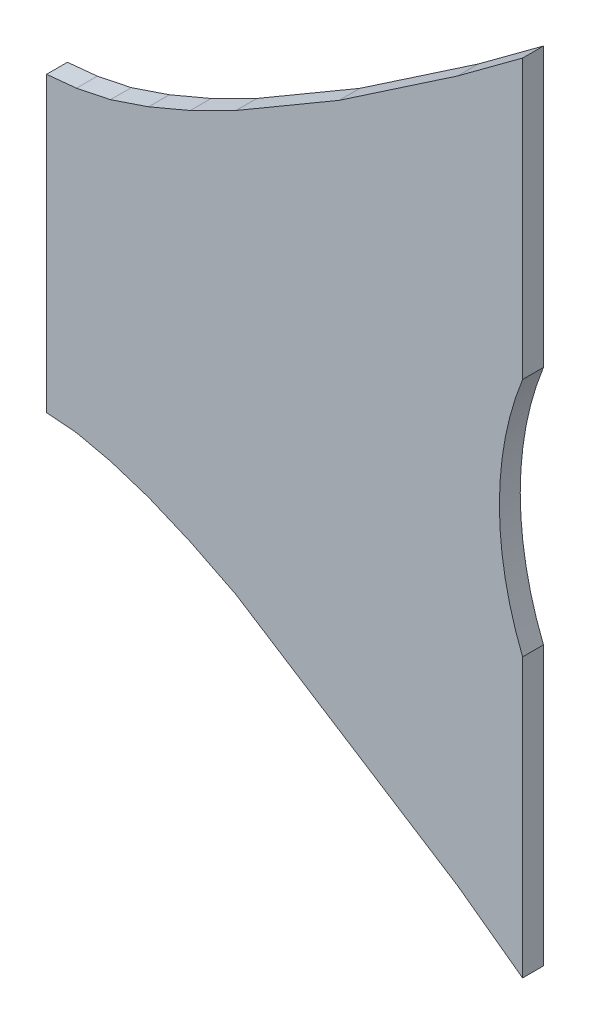
ISO-10303-21;
HEADER;
FILE_DESCRIPTION(('STEP AP214'),'2;1');
FILE_NAME('part.step','',(''),(''),'','','');
FILE_SCHEMA(('AUTOMOTIVE_DESIGN { 1 0 10303 214 1 1 1 1 }'));
ENDSEC;
DATA;
#1=APPLICATION_CONTEXT('core data for automotive mechanical design processes');
#2=APPLICATION_PROTOCOL_DEFINITION('international standard','automotive_design',2000,#1);
#3=PRODUCT_CONTEXT('',#1,'mechanical');
#4=PRODUCT('Part','Part','',(#3));
#5=PRODUCT_RELATED_PRODUCT_CATEGORY('part','',(#4));
#6=PRODUCT_DEFINITION_FORMATION('','',#4);
#7=PRODUCT_DEFINITION_CONTEXT('part definition',#1,'design');
#8=PRODUCT_DEFINITION('design','',#6,#7);
#9=PRODUCT_DEFINITION_SHAPE('','',#8);
#10=(LENGTH_UNIT() NAMED_UNIT(*) SI_UNIT(.MILLI.,.METRE.));
#11=(NAMED_UNIT(*) PLANE_ANGLE_UNIT() SI_UNIT($,.RADIAN.));
#12=(NAMED_UNIT(*) SI_UNIT($,.STERADIAN.) SOLID_ANGLE_UNIT());
#13=UNCERTAINTY_MEASURE_WITH_UNIT(LENGTH_MEASURE(1.E-05),#10,'distance_accuracy_value','');
#14=(GEOMETRIC_REPRESENTATION_CONTEXT(3) GLOBAL_UNCERTAINTY_ASSIGNED_CONTEXT((#13)) GLOBAL_UNIT_ASSIGNED_CONTEXT((#10,
#11,#12)) REPRESENTATION_CONTEXT('',''));
#15=CARTESIAN_POINT('',(0.,0.,0.));
#16=DIRECTION('',(0.,0.,1.));
#17=DIRECTION('',(1.,0.,0.));
#18=AXIS2_PLACEMENT_3D('',#15,#16,#17);
#19=CARTESIAN_POINT('',(84.4449996948242,53.1430015563965,0.));
#20=DIRECTION('',(1.,0.,0.));
#21=DIRECTION('',(0.,-1.,0.));
#22=AXIS2_PLACEMENT_3D('',#19,#20,#21);
#23=PLANE('',#22);
#24=DIRECTION('',(0.,-1.,0.));
#25=VECTOR('',#24,1.);
#26=CARTESIAN_POINT('',(84.4449996948242,53.1430015563965,0.03556));
#27=LINE('',#26,#25);
#28=CARTESIAN_POINT('',(84.4449996948242,53.1430015563965,0.03556));
#29=VERTEX_POINT('',#28);
#30=CARTESIAN_POINT('',(84.4449996948242,52.6430015563965,0.03556));
#31=VERTEX_POINT('',#30);
#32=EDGE_CURVE('E11',#29,#31,#27,.T.);
#33=ORIENTED_EDGE('',*,*,#32,.F.);
#34=DIRECTION('',(0.,0.,1.));
#35=VECTOR('',#34,1.);
#36=CARTESIAN_POINT('',(84.4449996948242,53.1430015563965,0.));
#37=LINE('',#36,#35);
#38=CARTESIAN_POINT('',(84.4449996948242,53.1430015563965,0.));
#39=VERTEX_POINT('',#38);
#40=EDGE_CURVE('E24',#39,#29,#37,.T.);
#41=ORIENTED_EDGE('',*,*,#40,.F.);
#42=DIRECTION('',(0.,-1.,0.));
#43=VECTOR('',#42,1.);
#44=CARTESIAN_POINT('',(84.4449996948242,53.1430015563965,0.));
#45=LINE('',#44,#43);
#46=CARTESIAN_POINT('',(84.4449996948242,52.6430015563965,0.));
#47=VERTEX_POINT('',#46);
#48=EDGE_CURVE('E297',#39,#47,#45,.T.);
#49=ORIENTED_EDGE('',*,*,#48,.T.);
#50=DIRECTION('',(0.,0.,1.));
#51=VECTOR('',#50,1.);
#52=CARTESIAN_POINT('',(84.4449996948242,52.6430015563965,0.));
#53=LINE('',#52,#51);
#54=EDGE_CURVE('E37',#47,#31,#53,.T.);
#55=ORIENTED_EDGE('',*,*,#54,.T.);
#56=EDGE_LOOP('',(#33,#41,#49,#55));
#57=FACE_BOUND('',#56,.T.);
#58=ADVANCED_FACE('F17',(#57),#23,.F.);
#59=CARTESIAN_POINT('',(84.4960021972656,53.1479988098144,0.));
#60=DIRECTION('',(0.0975135970444679,-0.995234192736287,0.));
#61=DIRECTION('',(-0.995234192736287,-0.0975135970444679,0.));
#62=AXIS2_PLACEMENT_3D('',#59,#60,#61);
#63=PLANE('',#62);
#64=DIRECTION('',(-0.995234192736287,-0.0975135970444679,0.));
#65=VECTOR('',#64,1.);
#66=CARTESIAN_POINT('',(84.4960021972656,53.1479988098144,0.03556));
#67=LINE('',#66,#65);
#68=CARTESIAN_POINT('',(84.4960021972656,53.1479988098144,0.03556));
#69=VERTEX_POINT('',#68);
#70=EDGE_CURVE('E293',#69,#29,#67,.T.);
#71=ORIENTED_EDGE('',*,*,#70,.F.);
#72=DIRECTION('',(0.,0.,1.));
#73=VECTOR('',#72,1.);
#74=CARTESIAN_POINT('',(84.4960021972656,53.1479988098144,0.));
#75=LINE('',#74,#73);
#76=CARTESIAN_POINT('',(84.4960021972656,53.1479988098144,0.));
#77=VERTEX_POINT('',#76);
#78=EDGE_CURVE('E291',#77,#69,#75,.T.);
#79=ORIENTED_EDGE('',*,*,#78,.F.);
#80=DIRECTION('',(-0.995234192736287,-0.0975135970444679,0.));
#81=VECTOR('',#80,1.);
#82=CARTESIAN_POINT('',(84.4960021972656,53.1479988098144,0.));
#83=LINE('',#82,#81);
#84=EDGE_CURVE('E289',#77,#39,#83,.T.);
#85=ORIENTED_EDGE('',*,*,#84,.T.);
#86=ORIENTED_EDGE('',*,*,#40,.T.);
#87=EDGE_LOOP('',(#71,#79,#85,#86));
#88=FACE_BOUND('',#87,.T.);
#89=ADVANCED_FACE('F300',(#88),#63,.F.);
#90=CARTESIAN_POINT('',(84.5540008544922,53.1599998474121,0.));
#91=DIRECTION('',(0.202626901888374,-0.97925601281336,0.));
#92=DIRECTION('',(-0.97925601281336,-0.202626901888374,0.));
#93=AXIS2_PLACEMENT_3D('',#90,#91,#92);
#94=PLANE('',#93);
#95=DIRECTION('',(-0.97925601281336,-0.202626901888374,0.));
#96=VECTOR('',#95,1.);
#97=CARTESIAN_POINT('',(84.5540008544922,53.1599998474121,0.03556));
#98=LINE('',#97,#96);
#99=CARTESIAN_POINT('',(84.5540008544922,53.1599998474121,0.03556));
#100=VERTEX_POINT('',#99);
#101=EDGE_CURVE('E286',#100,#69,#98,.T.);
#102=ORIENTED_EDGE('',*,*,#101,.F.);
#103=DIRECTION('',(0.,0.,1.));
#104=VECTOR('',#103,1.);
#105=CARTESIAN_POINT('',(84.5540008544922,53.1599998474121,0.));
#106=LINE('',#105,#104);
#107=CARTESIAN_POINT('',(84.5540008544922,53.1599998474121,0.));
#108=VERTEX_POINT('',#107);
#109=EDGE_CURVE('E284',#108,#100,#106,.T.);
#110=ORIENTED_EDGE('',*,*,#109,.F.);
#111=DIRECTION('',(-0.97925601281336,-0.202626901888374,0.));
#112=VECTOR('',#111,1.);
#113=CARTESIAN_POINT('',(84.5540008544922,53.1599998474121,0.));
#114=LINE('',#113,#112);
#115=EDGE_CURVE('E281',#108,#77,#114,.T.);
#116=ORIENTED_EDGE('',*,*,#115,.T.);
#117=ORIENTED_EDGE('',*,*,#78,.T.);
#118=EDGE_LOOP('',(#102,#110,#116,#117));
#119=FACE_BOUND('',#118,.T.);
#120=ADVANCED_FACE('F303',(#119),#94,.F.);
#121=CARTESIAN_POINT('',(84.6190032958984,53.181999206543,0.));
#122=DIRECTION('',(0.320576991668734,-0.947222461944724,0.));
#123=DIRECTION('',(-0.947222461944724,-0.320576991668734,0.));
#124=AXIS2_PLACEMENT_3D('',#121,#122,#123);
#125=PLANE('',#124);
#126=DIRECTION('',(-0.947222461944724,-0.320576991668734,0.));
#127=VECTOR('',#126,1.);
#128=CARTESIAN_POINT('',(84.6190032958984,53.181999206543,0.03556));
#129=LINE('',#128,#127);
#130=CARTESIAN_POINT('',(84.6190032958984,53.181999206543,0.03556));
#131=VERTEX_POINT('',#130);
#132=EDGE_CURVE('E278',#131,#100,#129,.T.);
#133=ORIENTED_EDGE('',*,*,#132,.F.);
#134=DIRECTION('',(0.,0.,1.));
#135=VECTOR('',#134,1.);
#136=CARTESIAN_POINT('',(84.6190032958984,53.181999206543,0.));
#137=LINE('',#136,#135);
#138=CARTESIAN_POINT('',(84.6190032958984,53.181999206543,0.));
#139=VERTEX_POINT('',#138);
#140=EDGE_CURVE('E276',#139,#131,#137,.T.);
#141=ORIENTED_EDGE('',*,*,#140,.F.);
#142=DIRECTION('',(-0.947222461944724,-0.320576991668734,0.));
#143=VECTOR('',#142,1.);
#144=CARTESIAN_POINT('',(84.6190032958984,53.181999206543,0.));
#145=LINE('',#144,#143);
#146=EDGE_CURVE('E273',#139,#108,#145,.T.);
#147=ORIENTED_EDGE('',*,*,#146,.T.);
#148=ORIENTED_EDGE('',*,*,#109,.T.);
#149=EDGE_LOOP('',(#133,#141,#147,#148));
#150=FACE_BOUND('',#149,.T.);
#151=ADVANCED_FACE('F308',(#150),#125,.F.);
#152=CARTESIAN_POINT('',(84.6900024414063,53.2120018005371,0.));
#153=DIRECTION('',(0.38924924135206,-0.921132470444315,0.));
#154=DIRECTION('',(-0.921132470444315,-0.38924924135206,0.));
#155=AXIS2_PLACEMENT_3D('',#152,#153,#154);
#156=PLANE('',#155);
#157=DIRECTION('',(-0.921132470444314,-0.38924924135206,0.));
#158=VECTOR('',#157,1.);
#159=CARTESIAN_POINT('',(84.6900024414063,53.2120018005371,0.03556));
#160=LINE('',#159,#158);
#161=CARTESIAN_POINT('',(84.6900024414063,53.2120018005371,0.03556));
#162=VERTEX_POINT('',#161);
#163=EDGE_CURVE('E270',#162,#131,#160,.T.);
#164=ORIENTED_EDGE('',*,*,#163,.F.);
#165=DIRECTION('',(0.,0.,1.));
#166=VECTOR('',#165,1.);
#167=CARTESIAN_POINT('',(84.6900024414063,53.2120018005371,0.));
#168=LINE('',#167,#166);
#169=CARTESIAN_POINT('',(84.6900024414063,53.2120018005371,0.));
#170=VERTEX_POINT('',#169);
#171=EDGE_CURVE('E268',#170,#162,#168,.T.);
#172=ORIENTED_EDGE('',*,*,#171,.F.);
#173=DIRECTION('',(-0.921132470444314,-0.38924924135206,0.));
#174=VECTOR('',#173,1.);
#175=CARTESIAN_POINT('',(84.6900024414063,53.2120018005371,0.));
#176=LINE('',#175,#174);
#177=EDGE_CURVE('E265',#170,#139,#176,.T.);
#178=ORIENTED_EDGE('',*,*,#177,.T.);
#179=ORIENTED_EDGE('',*,*,#140,.T.);
#180=EDGE_LOOP('',(#164,#172,#178,#179));
#181=FACE_BOUND('',#180,.T.);
#182=ADVANCED_FACE('F311',(#181),#156,.F.);
#183=CARTESIAN_POINT('',(84.7679977416992,53.2509994506836,0.));
#184=DIRECTION('',(0.447213595499958,-0.894427190999916,0.));
#185=DIRECTION('',(-0.894427190999916,-0.447213595499958,0.));
#186=AXIS2_PLACEMENT_3D('',#183,#184,#185);
#187=PLANE('',#186);
#188=DIRECTION('',(-0.894427190999916,-0.447213595499958,0.));
#189=VECTOR('',#188,1.);
#190=CARTESIAN_POINT('',(84.7679977416992,53.2509994506836,0.03556));
#191=LINE('',#190,#189);
#192=CARTESIAN_POINT('',(84.7679977416992,53.2509994506836,0.03556));
#193=VERTEX_POINT('',#192);
#194=EDGE_CURVE('E262',#193,#162,#191,.T.);
#195=ORIENTED_EDGE('',*,*,#194,.F.);
#196=DIRECTION('',(0.,0.,1.));
#197=VECTOR('',#196,1.);
#198=CARTESIAN_POINT('',(84.7679977416992,53.2509994506836,0.));
#199=LINE('',#198,#197);
#200=CARTESIAN_POINT('',(84.7679977416992,53.2509994506836,0.));
#201=VERTEX_POINT('',#200);
#202=EDGE_CURVE('E260',#201,#193,#199,.T.);
#203=ORIENTED_EDGE('',*,*,#202,.F.);
#204=DIRECTION('',(-0.894427190999916,-0.447213595499958,0.));
#205=VECTOR('',#204,1.);
#206=CARTESIAN_POINT('',(84.7679977416992,53.2509994506836,0.));
#207=LINE('',#206,#205);
#208=EDGE_CURVE('E257',#201,#170,#207,.T.);
#209=ORIENTED_EDGE('',*,*,#208,.T.);
#210=ORIENTED_EDGE('',*,*,#171,.T.);
#211=EDGE_LOOP('',(#195,#203,#209,#210));
#212=FACE_BOUND('',#211,.T.);
#213=ADVANCED_FACE('F316',(#212),#187,.F.);
#214=CARTESIAN_POINT('',(84.9440002441406,53.3540000915527,0.));
#215=DIRECTION('',(0.50508710963613,-0.86306837022302,0.));
#216=DIRECTION('',(-0.86306837022302,-0.50508710963613,0.));
#217=AXIS2_PLACEMENT_3D('',#214,#215,#216);
#218=PLANE('',#217);
#219=DIRECTION('',(-0.86306837022302,-0.50508710963613,0.));
#220=VECTOR('',#219,1.);
#221=CARTESIAN_POINT('',(84.9440002441406,53.3540000915527,0.03556));
#222=LINE('',#221,#220);
#223=CARTESIAN_POINT('',(84.9440002441406,53.3540000915527,0.03556));
#224=VERTEX_POINT('',#223);
#225=EDGE_CURVE('E254',#224,#193,#222,.T.);
#226=ORIENTED_EDGE('',*,*,#225,.F.);
#227=DIRECTION('',(0.,0.,1.));
#228=VECTOR('',#227,1.);
#229=CARTESIAN_POINT('',(84.9440002441406,53.3540000915527,0.));
#230=LINE('',#229,#228);
#231=CARTESIAN_POINT('',(84.9440002441406,53.3540000915527,0.));
#232=VERTEX_POINT('',#231);
#233=EDGE_CURVE('E252',#232,#224,#230,.T.);
#234=ORIENTED_EDGE('',*,*,#233,.F.);
#235=DIRECTION('',(-0.86306837022302,-0.50508710963613,0.));
#236=VECTOR('',#235,1.);
#237=CARTESIAN_POINT('',(84.9440002441406,53.3540000915527,0.));
#238=LINE('',#237,#236);
#239=EDGE_CURVE('E249',#232,#201,#238,.T.);
#240=ORIENTED_EDGE('',*,*,#239,.T.);
#241=ORIENTED_EDGE('',*,*,#202,.T.);
#242=EDGE_LOOP('',(#226,#234,#240,#241));
#243=FACE_BOUND('',#242,.T.);
#244=ADVANCED_FACE('F319',(#243),#218,.F.);
#245=CARTESIAN_POINT('',(85.1460037231445,53.4910011291504,0.));
#246=DIRECTION('',(0.561297310666813,-0.827614239267428,0.));
#247=DIRECTION('',(-0.827614239267428,-0.561297310666813,0.));
#248=AXIS2_PLACEMENT_3D('',#245,#246,#247);
#249=PLANE('',#248);
#250=DIRECTION('',(-0.827614239267428,-0.561297310666813,0.));
#251=VECTOR('',#250,1.);
#252=CARTESIAN_POINT('',(85.1460037231445,53.4910011291504,0.03556));
#253=LINE('',#252,#251);
#254=CARTESIAN_POINT('',(85.1460037231445,53.4910011291504,0.03556));
#255=VERTEX_POINT('',#254);
#256=EDGE_CURVE('E246',#255,#224,#253,.T.);
#257=ORIENTED_EDGE('',*,*,#256,.F.);
#258=DIRECTION('',(0.,0.,1.));
#259=VECTOR('',#258,1.);
#260=CARTESIAN_POINT('',(85.1460037231445,53.4910011291504,0.));
#261=LINE('',#260,#259);
#262=CARTESIAN_POINT('',(85.1460037231445,53.4910011291504,0.));
#263=VERTEX_POINT('',#262);
#264=EDGE_CURVE('E244',#263,#255,#261,.T.);
#265=ORIENTED_EDGE('',*,*,#264,.F.);
#266=DIRECTION('',(-0.827614239267428,-0.561297310666813,0.));
#267=VECTOR('',#266,1.);
#268=CARTESIAN_POINT('',(85.1460037231445,53.4910011291504,0.));
#269=LINE('',#268,#267);
#270=EDGE_CURVE('E241',#263,#232,#269,.T.);
#271=ORIENTED_EDGE('',*,*,#270,.T.);
#272=ORIENTED_EDGE('',*,*,#233,.T.);
#273=EDGE_LOOP('',(#257,#265,#271,#272));
#274=FACE_BOUND('',#273,.T.);
#275=ADVANCED_FACE('F324',(#274),#249,.F.);
#276=CARTESIAN_POINT('',(85.2570037841797,53.5730018615723,0.));
#277=DIRECTION('',(0.594190520477867,-0.804324328473435,0.));
#278=DIRECTION('',(-0.804324328473435,-0.594190520477867,0.));
#279=AXIS2_PLACEMENT_3D('',#276,#277,#278);
#280=PLANE('',#279);
#281=DIRECTION('',(-0.804324328473435,-0.594190520477867,0.));
#282=VECTOR('',#281,1.);
#283=CARTESIAN_POINT('',(85.2570037841797,53.5730018615723,0.03556));
#284=LINE('',#283,#282);
#285=CARTESIAN_POINT('',(85.2570037841797,53.5730018615723,0.03556));
#286=VERTEX_POINT('',#285);
#287=EDGE_CURVE('E238',#286,#255,#284,.T.);
#288=ORIENTED_EDGE('',*,*,#287,.F.);
#289=DIRECTION('',(0.,0.,1.));
#290=VECTOR('',#289,1.);
#291=CARTESIAN_POINT('',(85.2570037841797,53.5730018615723,0.));
#292=LINE('',#291,#290);
#293=CARTESIAN_POINT('',(85.2570037841797,53.5730018615723,0.));
#294=VERTEX_POINT('',#293);
#295=EDGE_CURVE('E236',#294,#286,#292,.T.);
#296=ORIENTED_EDGE('',*,*,#295,.F.);
#297=DIRECTION('',(-0.804324328473435,-0.594190520477867,0.));
#298=VECTOR('',#297,1.);
#299=CARTESIAN_POINT('',(85.2570037841797,53.5730018615723,0.));
#300=LINE('',#299,#298);
#301=EDGE_CURVE('E233',#294,#263,#300,.T.);
#302=ORIENTED_EDGE('',*,*,#301,.T.);
#303=ORIENTED_EDGE('',*,*,#264,.T.);
#304=EDGE_LOOP('',(#288,#296,#302,#303));
#305=FACE_BOUND('',#304,.T.);
#306=ADVANCED_FACE('F327',(#305),#280,.F.);
#307=CARTESIAN_POINT('',(85.2570037841797,53.0981455416273,0.));
#308=DIRECTION('',(-1.,0.,0.));
#309=DIRECTION('',(0.,1.,0.));
#310=AXIS2_PLACEMENT_3D('',#307,#308,#309);
#311=PLANE('',#310);
#312=DIRECTION('',(0.,1.,0.));
#313=VECTOR('',#312,1.);
#314=CARTESIAN_POINT('',(85.2570037841797,52.2140007019043,0.03556));
#315=LINE('',#314,#313);
#316=CARTESIAN_POINT('',(85.2570037841797,53.0981455416273,0.03556));
#317=VERTEX_POINT('',#316);
#318=EDGE_CURVE('E230',#317,#286,#315,.T.);
#319=ORIENTED_EDGE('',*,*,#318,.F.);
#320=DIRECTION('',(0.,0.,1.));
#321=VECTOR('',#320,1.);
#322=CARTESIAN_POINT('',(85.2570037841797,53.0981455416273,0.));
#323=LINE('',#322,#321);
#324=CARTESIAN_POINT('',(85.2570037841797,53.0981455416273,0.));
#325=VERTEX_POINT('',#324);
#326=EDGE_CURVE('E228',#325,#317,#323,.T.);
#327=ORIENTED_EDGE('',*,*,#326,.F.);
#328=DIRECTION('',(0.,1.,0.));
#329=VECTOR('',#328,1.);
#330=CARTESIAN_POINT('',(85.2570037841797,52.2140007019043,0.));
#331=LINE('',#330,#329);
#332=EDGE_CURVE('E225',#325,#294,#331,.T.);
#333=ORIENTED_EDGE('',*,*,#332,.T.);
#334=ORIENTED_EDGE('',*,*,#295,.T.);
#335=EDGE_LOOP('',(#319,#327,#333,#334));
#336=FACE_BOUND('',#335,.T.);
#337=ADVANCED_FACE('F332',(#336),#311,.F.);
#338=CARTESIAN_POINT('',(85.767418,52.8932648,0.));
#339=DIRECTION('',(0.,0.,-1.));
#340=DIRECTION('',(1.,0.,0.));
#341=AXIS2_PLACEMENT_3D('',#338,#339,#340);
#342=CYLINDRICAL_SURFACE('',#341,0.5499989);
#343=ORIENTED_EDGE('',*,*,#326,.T.);
#344=CARTESIAN_POINT('',(85.767418,52.8932648,0.03556));
#345=DIRECTION('',(0.,0.,1.));
#346=DIRECTION('',(1.,0.,0.));
#347=AXIS2_PLACEMENT_3D('',#344,#345,#346);
#348=CIRCLE('',#347,0.5499989);
#349=CARTESIAN_POINT('',(85.2570037841797,52.6883840583727,0.03556));
#350=VERTEX_POINT('',#349);
#351=EDGE_CURVE('E222',#317,#350,#348,.T.);
#352=ORIENTED_EDGE('',*,*,#351,.T.);
#353=DIRECTION('',(0.,0.,1.));
#354=VECTOR('',#353,1.);
#355=CARTESIAN_POINT('',(85.2570037841797,52.6883840583727,0.));
#356=LINE('',#355,#354);
#357=CARTESIAN_POINT('',(85.2570037841797,52.6883840583727,0.));
#358=VERTEX_POINT('',#357);
#359=EDGE_CURVE('E220',#358,#350,#356,.T.);
#360=ORIENTED_EDGE('',*,*,#359,.F.);
#361=CARTESIAN_POINT('',(85.767418,52.8932648,0.));
#362=DIRECTION('',(0.,0.,1.));
#363=DIRECTION('',(1.,0.,0.));
#364=AXIS2_PLACEMENT_3D('',#361,#362,#363);
#365=CIRCLE('',#364,0.5499989);
#366=EDGE_CURVE('E217',#325,#358,#365,.T.);
#367=ORIENTED_EDGE('',*,*,#366,.F.);
#368=EDGE_LOOP('',(#343,#352,#360,#367));
#369=FACE_BOUND('',#368,.T.);
#370=ADVANCED_FACE('F335',(#369),#342,.F.);
#371=CARTESIAN_POINT('',(85.2570037841797,52.2140007019043,0.));
#372=DIRECTION('',(-1.,0.,0.));
#373=DIRECTION('',(0.,1.,0.));
#374=AXIS2_PLACEMENT_3D('',#371,#372,#373);
#375=PLANE('',#374);
#376=DIRECTION('',(0.,1.,0.));
#377=VECTOR('',#376,1.);
#378=CARTESIAN_POINT('',(85.2570037841797,52.2140007019043,0.03556));
#379=LINE('',#378,#377);
#380=CARTESIAN_POINT('',(85.2570037841797,52.2140007019043,0.03556));
#381=VERTEX_POINT('',#380);
#382=EDGE_CURVE('E214',#381,#350,#379,.T.);
#383=ORIENTED_EDGE('',*,*,#382,.F.);
#384=DIRECTION('',(0.,0.,1.));
#385=VECTOR('',#384,1.);
#386=CARTESIAN_POINT('',(85.2570037841797,52.2140007019043,0.));
#387=LINE('',#386,#385);
#388=CARTESIAN_POINT('',(85.2570037841797,52.2140007019043,0.));
#389=VERTEX_POINT('',#388);
#390=EDGE_CURVE('E212',#389,#381,#387,.T.);
#391=ORIENTED_EDGE('',*,*,#390,.F.);
#392=EDGE_CURVE('E211',#389,#358,#331,.T.);
#393=ORIENTED_EDGE('',*,*,#392,.T.);
#394=ORIENTED_EDGE('',*,*,#359,.T.);
#395=EDGE_LOOP('',(#383,#391,#393,#394));
#396=FACE_BOUND('',#395,.T.);
#397=ADVANCED_FACE('F341',(#396),#375,.F.);
#398=CARTESIAN_POINT('',(85.1460037231445,52.2949981689453,0.));
#399=DIRECTION('',(0.589456830119267,0.80779987956532,0.));
#400=DIRECTION('',(0.80779987956532,-0.589456830119267,0.));
#401=AXIS2_PLACEMENT_3D('',#398,#399,#400);
#402=PLANE('',#401);
#403=DIRECTION('',(0.80779987956532,-0.589456830119267,0.));
#404=VECTOR('',#403,1.);
#405=CARTESIAN_POINT('',(85.1460037231445,52.2949981689453,0.03556));
#406=LINE('',#405,#404);
#407=CARTESIAN_POINT('',(85.1460037231445,52.2949981689453,0.03556));
#408=VERTEX_POINT('',#407);
#409=EDGE_CURVE('E208',#408,#381,#406,.T.);
#410=ORIENTED_EDGE('',*,*,#409,.F.);
#411=DIRECTION('',(0.,0.,1.));
#412=VECTOR('',#411,1.);
#413=CARTESIAN_POINT('',(85.1460037231445,52.2949981689453,0.));
#414=LINE('',#413,#412);
#415=CARTESIAN_POINT('',(85.1460037231445,52.2949981689453,0.));
#416=VERTEX_POINT('',#415);
#417=EDGE_CURVE('E206',#416,#408,#414,.T.);
#418=ORIENTED_EDGE('',*,*,#417,.F.);
#419=DIRECTION('',(0.80779987956532,-0.589456830119267,0.));
#420=VECTOR('',#419,1.);
#421=CARTESIAN_POINT('',(85.1460037231445,52.2949981689453,0.));
#422=LINE('',#421,#420);
#423=EDGE_CURVE('E203',#416,#389,#422,.T.);
#424=ORIENTED_EDGE('',*,*,#423,.T.);
#425=ORIENTED_EDGE('',*,*,#390,.T.);
#426=EDGE_LOOP('',(#410,#418,#424,#425));
#427=FACE_BOUND('',#426,.T.);
#428=ADVANCED_FACE('F344',(#427),#402,.F.);
#429=CARTESIAN_POINT('',(84.7679977416992,52.5359992980957,0.));
#430=DIRECTION('',(0.537592733088454,0.843204633129163,0.));
#431=DIRECTION('',(0.843204633129163,-0.537592733088454,0.));
#432=AXIS2_PLACEMENT_3D('',#429,#430,#431);
#433=PLANE('',#432);
#434=DIRECTION('',(0.843204633129163,-0.537592733088454,0.));
#435=VECTOR('',#434,1.);
#436=CARTESIAN_POINT('',(84.7679977416992,52.5359992980957,0.03556));
#437=LINE('',#436,#435);
#438=CARTESIAN_POINT('',(84.7679977416992,52.5359992980957,0.03556));
#439=VERTEX_POINT('',#438);
#440=EDGE_CURVE('E200',#439,#408,#437,.T.);
#441=ORIENTED_EDGE('',*,*,#440,.F.);
#442=DIRECTION('',(0.,0.,1.));
#443=VECTOR('',#442,1.);
#444=CARTESIAN_POINT('',(84.7679977416992,52.5359992980957,0.));
#445=LINE('',#444,#443);
#446=CARTESIAN_POINT('',(84.7679977416992,52.5359992980957,0.));
#447=VERTEX_POINT('',#446);
#448=EDGE_CURVE('E198',#447,#439,#445,.T.);
#449=ORIENTED_EDGE('',*,*,#448,.F.);
#450=DIRECTION('',(0.843204633129163,-0.537592733088454,0.));
#451=VECTOR('',#450,1.);
#452=CARTESIAN_POINT('',(84.7679977416992,52.5359992980957,0.));
#453=LINE('',#452,#451);
#454=EDGE_CURVE('E195',#447,#416,#453,.T.);
#455=ORIENTED_EDGE('',*,*,#454,.T.);
#456=ORIENTED_EDGE('',*,*,#417,.T.);
#457=EDGE_LOOP('',(#441,#449,#455,#456));
#458=FACE_BOUND('',#457,.T.);
#459=ADVANCED_FACE('F349',(#458),#433,.F.);
#460=CARTESIAN_POINT('',(84.6900024414063,52.5750007629395,0.));
#461=DIRECTION('',(0.447248591135036,0.894409692326579,0.));
#462=DIRECTION('',(0.894409692326579,-0.447248591135036,0.));
#463=AXIS2_PLACEMENT_3D('',#460,#461,#462);
#464=PLANE('',#463);
#465=DIRECTION('',(0.894409692326579,-0.447248591135036,0.));
#466=VECTOR('',#465,1.);
#467=CARTESIAN_POINT('',(84.6900024414063,52.5750007629395,0.03556));
#468=LINE('',#467,#466);
#469=CARTESIAN_POINT('',(84.6900024414063,52.5750007629395,0.03556));
#470=VERTEX_POINT('',#469);
#471=EDGE_CURVE('E192',#470,#439,#468,.T.);
#472=ORIENTED_EDGE('',*,*,#471,.F.);
#473=DIRECTION('',(0.,0.,1.));
#474=VECTOR('',#473,1.);
#475=CARTESIAN_POINT('',(84.6900024414063,52.5750007629395,0.));
#476=LINE('',#475,#474);
#477=CARTESIAN_POINT('',(84.6900024414063,52.5750007629395,0.));
#478=VERTEX_POINT('',#477);
#479=EDGE_CURVE('E190',#478,#470,#476,.T.);
#480=ORIENTED_EDGE('',*,*,#479,.F.);
#481=DIRECTION('',(0.894409692326579,-0.447248591135036,0.));
#482=VECTOR('',#481,1.);
#483=CARTESIAN_POINT('',(84.6900024414063,52.5750007629395,0.));
#484=LINE('',#483,#482);
#485=EDGE_CURVE('E187',#478,#447,#484,.T.);
#486=ORIENTED_EDGE('',*,*,#485,.T.);
#487=ORIENTED_EDGE('',*,*,#448,.T.);
#488=EDGE_LOOP('',(#472,#480,#486,#487));
#489=FACE_BOUND('',#488,.T.);
#490=ADVANCED_FACE('F352',(#489),#464,.F.);
#491=CARTESIAN_POINT('',(84.6190032958984,52.6049995422363,0.));
#492=DIRECTION('',(0.389207247493552,0.921150214947862,0.));
#493=DIRECTION('',(0.921150214947862,-0.389207247493552,0.));
#494=AXIS2_PLACEMENT_3D('',#491,#492,#493);
#495=PLANE('',#494);
#496=DIRECTION('',(0.921150214947862,-0.389207247493552,0.));
#497=VECTOR('',#496,1.);
#498=CARTESIAN_POINT('',(84.6190032958984,52.6049995422363,0.03556));
#499=LINE('',#498,#497);
#500=CARTESIAN_POINT('',(84.6190032958984,52.6049995422363,0.03556));
#501=VERTEX_POINT('',#500);
#502=EDGE_CURVE('E184',#501,#470,#499,.T.);
#503=ORIENTED_EDGE('',*,*,#502,.F.);
#504=DIRECTION('',(0.,0.,1.));
#505=VECTOR('',#504,1.);
#506=CARTESIAN_POINT('',(84.6190032958984,52.6049995422363,0.));
#507=LINE('',#506,#505);
#508=CARTESIAN_POINT('',(84.6190032958984,52.6049995422363,0.));
#509=VERTEX_POINT('',#508);
#510=EDGE_CURVE('E182',#509,#501,#507,.T.);
#511=ORIENTED_EDGE('',*,*,#510,.F.);
#512=DIRECTION('',(0.921150214947862,-0.389207247493552,0.));
#513=VECTOR('',#512,1.);
#514=CARTESIAN_POINT('',(84.6190032958984,52.6049995422363,0.));
#515=LINE('',#514,#513);
#516=EDGE_CURVE('E179',#509,#478,#515,.T.);
#517=ORIENTED_EDGE('',*,*,#516,.T.);
#518=ORIENTED_EDGE('',*,*,#479,.T.);
#519=EDGE_LOOP('',(#503,#511,#517,#518));
#520=FACE_BOUND('',#519,.T.);
#521=ADVANCED_FACE('F355',(#520),#495,.F.);
#522=CARTESIAN_POINT('',(84.5540008544922,52.6259994506836,0.));
#523=DIRECTION('',(0.307418814077381,0.951574312784481,0.));
#524=DIRECTION('',(0.951574312784481,-0.307418814077381,0.));
#525=AXIS2_PLACEMENT_3D('',#522,#523,#524);
#526=PLANE('',#525);
#527=DIRECTION('',(0.951574312784481,-0.307418814077381,0.));
#528=VECTOR('',#527,1.);
#529=CARTESIAN_POINT('',(84.5540008544922,52.6259994506836,0.03556));
#530=LINE('',#529,#528);
#531=CARTESIAN_POINT('',(84.5540008544922,52.6259994506836,0.03556));
#532=VERTEX_POINT('',#531);
#533=EDGE_CURVE('E176',#532,#501,#530,.T.);
#534=ORIENTED_EDGE('',*,*,#533,.F.);
#535=DIRECTION('',(0.,0.,1.));
#536=VECTOR('',#535,1.);
#537=CARTESIAN_POINT('',(84.5540008544922,52.6259994506836,0.));
#538=LINE('',#537,#536);
#539=CARTESIAN_POINT('',(84.5540008544922,52.6259994506836,0.));
#540=VERTEX_POINT('',#539);
#541=EDGE_CURVE('E174',#540,#532,#538,.T.);
#542=ORIENTED_EDGE('',*,*,#541,.F.);
#543=DIRECTION('',(0.951574312784481,-0.307418814077381,0.));
#544=VECTOR('',#543,1.);
#545=CARTESIAN_POINT('',(84.5540008544922,52.6259994506836,0.));
#546=LINE('',#545,#544);
#547=EDGE_CURVE('E165',#540,#509,#546,.T.);
#548=ORIENTED_EDGE('',*,*,#547,.T.);
#549=ORIENTED_EDGE('',*,*,#510,.T.);
#550=EDGE_LOOP('',(#534,#542,#548,#549));
#551=FACE_BOUND('',#550,.T.);
#552=ADVANCED_FACE('F358',(#551),#526,.F.);
#553=CARTESIAN_POINT('',(84.4960021972656,52.6389999389648,0.));
#554=DIRECTION('',(0.218724100263412,0.97578674307656,0.));
#555=DIRECTION('',(0.97578674307656,-0.218724100263412,0.));
#556=AXIS2_PLACEMENT_3D('',#553,#554,#555);
#557=PLANE('',#556);
#558=DIRECTION('',(0.97578674307656,-0.218724100263412,0.));
#559=VECTOR('',#558,1.);
#560=CARTESIAN_POINT('',(84.4960021972656,52.6389999389648,0.03556));
#561=LINE('',#560,#559);
#562=CARTESIAN_POINT('',(84.4960021972656,52.6389999389648,0.03556));
#563=VERTEX_POINT('',#562);
#564=EDGE_CURVE('E151',#563,#532,#561,.T.);
#565=ORIENTED_EDGE('',*,*,#564,.F.);
#566=DIRECTION('',(0.,0.,1.));
#567=VECTOR('',#566,1.);
#568=CARTESIAN_POINT('',(84.4960021972656,52.6389999389648,0.));
#569=LINE('',#568,#567);
#570=CARTESIAN_POINT('',(84.4960021972656,52.6389999389648,0.));
#571=VERTEX_POINT('',#570);
#572=EDGE_CURVE('E146',#571,#563,#569,.T.);
#573=ORIENTED_EDGE('',*,*,#572,.F.);
#574=DIRECTION('',(0.97578674307656,-0.218724100263412,0.));
#575=VECTOR('',#574,1.);
#576=CARTESIAN_POINT('',(84.4960021972656,52.6389999389648,0.));
#577=LINE('',#576,#575);
#578=EDGE_CURVE('E149',#571,#540,#577,.T.);
#579=ORIENTED_EDGE('',*,*,#578,.T.);
#580=ORIENTED_EDGE('',*,*,#541,.T.);
#581=EDGE_LOOP('',(#565,#573,#579,#580));
#582=FACE_BOUND('',#581,.T.);
#583=ADVANCED_FACE('F148',(#582),#557,.F.);
#584=CARTESIAN_POINT('',(84.4449996948242,52.6430015563965,0.));
#585=DIRECTION('',(0.0782188546282307,0.996936211991844,0.));
#586=DIRECTION('',(0.996936211991844,-0.0782188546282307,0.));
#587=AXIS2_PLACEMENT_3D('',#584,#585,#586);
#588=PLANE('',#587);
#589=DIRECTION('',(0.996936211991844,-0.0782188546282307,0.));
#590=VECTOR('',#589,1.);
#591=CARTESIAN_POINT('',(84.4449996948242,52.6430015563965,0.03556));
#592=LINE('',#591,#590);
#593=EDGE_CURVE('E166',#31,#563,#592,.T.);
#594=ORIENTED_EDGE('',*,*,#593,.F.);
#595=ORIENTED_EDGE('',*,*,#54,.F.);
#596=DIRECTION('',(0.996936211991844,-0.0782188546282307,0.));
#597=VECTOR('',#596,1.);
#598=CARTESIAN_POINT('',(84.4449996948242,52.6430015563965,0.));
#599=LINE('',#598,#597);
#600=EDGE_CURVE('E162',#47,#571,#599,.T.);
#601=ORIENTED_EDGE('',*,*,#600,.T.);
#602=ORIENTED_EDGE('',*,*,#572,.T.);
#603=EDGE_LOOP('',(#594,#595,#601,#602));
#604=FACE_BOUND('',#603,.T.);
#605=ADVANCED_FACE('F168',(#604),#588,.F.);
#606=CARTESIAN_POINT('',(84.4449996948242,52.6430015563965,0.));
#607=DIRECTION('',(0.,0.,1.));
#608=DIRECTION('',(1.,0.,0.));
#609=AXIS2_PLACEMENT_3D('',#606,#607,#608);
#610=PLANE('',#609);
#611=ORIENTED_EDGE('',*,*,#600,.F.);
#612=ORIENTED_EDGE('',*,*,#48,.F.);
#613=ORIENTED_EDGE('',*,*,#84,.F.);
#614=ORIENTED_EDGE('',*,*,#115,.F.);
#615=ORIENTED_EDGE('',*,*,#146,.F.);
#616=ORIENTED_EDGE('',*,*,#177,.F.);
#617=ORIENTED_EDGE('',*,*,#208,.F.);
#618=ORIENTED_EDGE('',*,*,#239,.F.);
#619=ORIENTED_EDGE('',*,*,#270,.F.);
#620=ORIENTED_EDGE('',*,*,#301,.F.);
#621=ORIENTED_EDGE('',*,*,#332,.F.);
#622=ORIENTED_EDGE('',*,*,#366,.T.);
#623=ORIENTED_EDGE('',*,*,#392,.F.);
#624=ORIENTED_EDGE('',*,*,#423,.F.);
#625=ORIENTED_EDGE('',*,*,#454,.F.);
#626=ORIENTED_EDGE('',*,*,#485,.F.);
#627=ORIENTED_EDGE('',*,*,#516,.F.);
#628=ORIENTED_EDGE('',*,*,#547,.F.);
#629=ORIENTED_EDGE('',*,*,#578,.F.);
#630=EDGE_LOOP('',(#611,#612,#613,#614,#615,#616,#617,#618,#619,#620,#621,#622,#623,#624,#625,
#626,#627,#628,#629));
#631=FACE_BOUND('',#630,.T.);
#632=ADVANCED_FACE('F160',(#631),#610,.F.);
#633=CARTESIAN_POINT('',(84.4449996948242,52.6430015563965,0.03556));
#634=DIRECTION('',(0.,0.,1.));
#635=DIRECTION('',(1.,0.,0.));
#636=AXIS2_PLACEMENT_3D('',#633,#634,#635);
#637=PLANE('',#636);
#638=ORIENTED_EDGE('',*,*,#32,.T.);
#639=ORIENTED_EDGE('',*,*,#593,.T.);
#640=ORIENTED_EDGE('',*,*,#564,.T.);
#641=ORIENTED_EDGE('',*,*,#533,.T.);
#642=ORIENTED_EDGE('',*,*,#502,.T.);
#643=ORIENTED_EDGE('',*,*,#471,.T.);
#644=ORIENTED_EDGE('',*,*,#440,.T.);
#645=ORIENTED_EDGE('',*,*,#409,.T.);
#646=ORIENTED_EDGE('',*,*,#382,.T.);
#647=ORIENTED_EDGE('',*,*,#351,.F.);
#648=ORIENTED_EDGE('',*,*,#318,.T.);
#649=ORIENTED_EDGE('',*,*,#287,.T.);
#650=ORIENTED_EDGE('',*,*,#256,.T.);
#651=ORIENTED_EDGE('',*,*,#225,.T.);
#652=ORIENTED_EDGE('',*,*,#194,.T.);
#653=ORIENTED_EDGE('',*,*,#163,.T.);
#654=ORIENTED_EDGE('',*,*,#132,.T.);
#655=ORIENTED_EDGE('',*,*,#101,.T.);
#656=ORIENTED_EDGE('',*,*,#70,.T.);
#657=EDGE_LOOP('',(#638,#639,#640,#641,#642,#643,#644,#645,#646,#647,#648,#649,#650,#651,#652,
#653,#654,#655,#656));
#658=FACE_BOUND('',#657,.T.);
#659=ADVANCED_FACE('F360',(#658),#637,.T.);
#660=CLOSED_SHELL('',(#58,#89,#120,#151,#182,#213,#244,#275,#306,#337,#370,#397,#428,#459,#490,
#521,#552,#583,#605,#632,#659));
#661=MANIFOLD_SOLID_BREP('B1',#660);
#662=ADVANCED_BREP_SHAPE_REPRESENTATION('',(#18,#661),#14);
#663=SHAPE_DEFINITION_REPRESENTATION(#9,#662);
ENDSEC;
END-ISO-10303-21;
